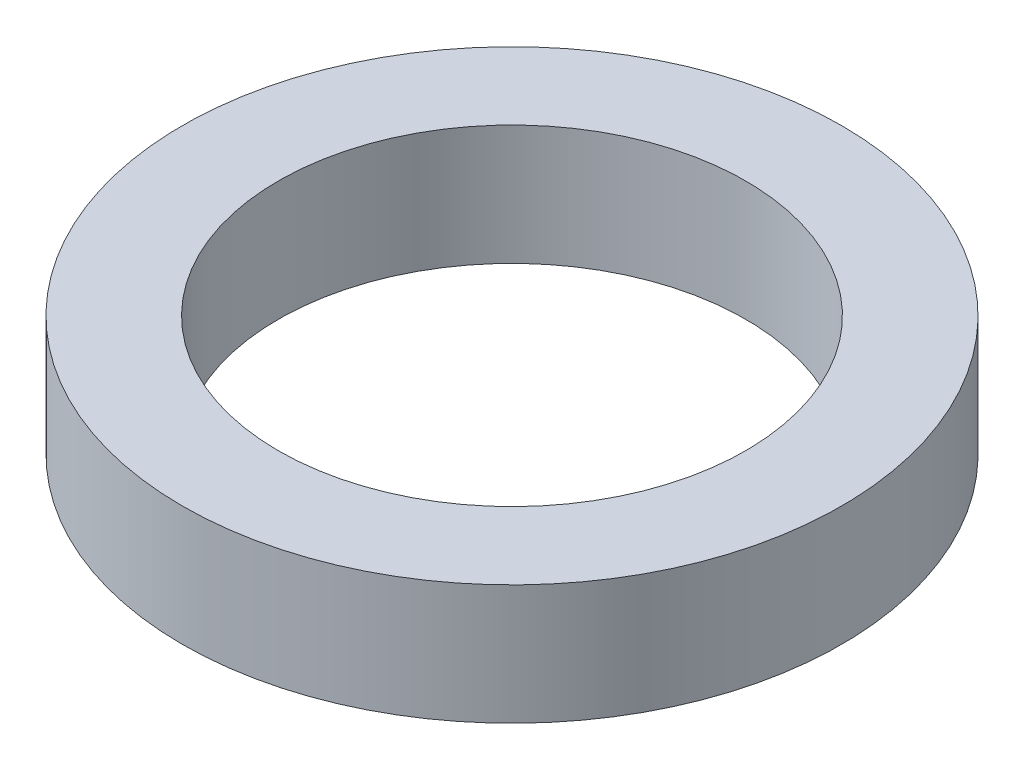
ISO-10303-21;
HEADER;
FILE_DESCRIPTION(('STEP AP214'),'2;1');
FILE_NAME('part.step','',(''),(''),'','','');
FILE_SCHEMA(('AUTOMOTIVE_DESIGN { 1 0 10303 214 1 1 1 1 }'));
ENDSEC;
DATA;
#1=APPLICATION_CONTEXT('core data for automotive mechanical design processes');
#2=APPLICATION_PROTOCOL_DEFINITION('international standard','automotive_design',2000,#1);
#3=PRODUCT_CONTEXT('',#1,'mechanical');
#4=PRODUCT('Part','Part','',(#3));
#5=PRODUCT_RELATED_PRODUCT_CATEGORY('part','',(#4));
#6=PRODUCT_DEFINITION_FORMATION('','',#4);
#7=PRODUCT_DEFINITION_CONTEXT('part definition',#1,'design');
#8=PRODUCT_DEFINITION('design','',#6,#7);
#9=PRODUCT_DEFINITION_SHAPE('','',#8);
#10=(LENGTH_UNIT() NAMED_UNIT(*) SI_UNIT(.MILLI.,.METRE.));
#11=(NAMED_UNIT(*) PLANE_ANGLE_UNIT() SI_UNIT($,.RADIAN.));
#12=(NAMED_UNIT(*) SI_UNIT($,.STERADIAN.) SOLID_ANGLE_UNIT());
#13=UNCERTAINTY_MEASURE_WITH_UNIT(LENGTH_MEASURE(1.E-05),#10,'distance_accuracy_value','');
#14=(GEOMETRIC_REPRESENTATION_CONTEXT(3) GLOBAL_UNCERTAINTY_ASSIGNED_CONTEXT((#13)) GLOBAL_UNIT_ASSIGNED_CONTEXT((#10,
#11,#12)) REPRESENTATION_CONTEXT('',''));
#15=CARTESIAN_POINT('',(0.,0.,0.));
#16=DIRECTION('',(0.,0.,1.));
#17=DIRECTION('',(1.,0.,0.));
#18=AXIS2_PLACEMENT_3D('',#15,#16,#17);
#19=CARTESIAN_POINT('',(0.,1.016,0.));
#20=DIRECTION('',(0.,1.,0.));
#21=DIRECTION('',(0.,0.,1.));
#22=AXIS2_PLACEMENT_3D('',#19,#20,#21);
#23=PLANE('',#22);
#24=CARTESIAN_POINT('',(0.,1.016,0.));
#25=DIRECTION('',(0.,1.,0.));
#26=DIRECTION('',(0.,0.,1.));
#27=AXIS2_PLACEMENT_3D('',#24,#25,#26);
#28=CIRCLE('',#27,2.794);
#29=CARTESIAN_POINT('',(0.,1.016,2.794));
#30=VERTEX_POINT('',#29);
#31=EDGE_CURVE('E10',#30,#30,#28,.T.);
#32=ORIENTED_EDGE('',*,*,#31,.T.);
#33=EDGE_LOOP('',(#32));
#34=FACE_BOUND('',#33,.T.);
#35=CARTESIAN_POINT('',(0.,1.016,0.));
#36=DIRECTION('',(0.,1.,0.));
#37=DIRECTION('',(0.,0.,1.));
#38=AXIS2_PLACEMENT_3D('',#35,#36,#37);
#39=CIRCLE('',#38,1.9812);
#40=CARTESIAN_POINT('',(0.,1.016,1.9812));
#41=VERTEX_POINT('',#40);
#42=EDGE_CURVE('E43',#41,#41,#39,.T.);
#43=ORIENTED_EDGE('',*,*,#42,.F.);
#44=EDGE_LOOP('',(#43));
#45=FACE_BOUND('',#44,.T.);
#46=ADVANCED_FACE('F32',(#34,#45),#23,.T.);
#47=CARTESIAN_POINT('',(0.,0.,0.));
#48=DIRECTION('',(0.,1.,0.));
#49=DIRECTION('',(0.,0.,1.));
#50=AXIS2_PLACEMENT_3D('',#47,#48,#49);
#51=PLANE('',#50);
#52=CARTESIAN_POINT('',(0.,0.,0.));
#53=DIRECTION('',(0.,1.,0.));
#54=DIRECTION('',(0.,0.,1.));
#55=AXIS2_PLACEMENT_3D('',#52,#53,#54);
#56=CIRCLE('',#55,2.794);
#57=CARTESIAN_POINT('',(0.,0.,2.794));
#58=VERTEX_POINT('',#57);
#59=EDGE_CURVE('E36',#58,#58,#56,.T.);
#60=ORIENTED_EDGE('',*,*,#59,.F.);
#61=EDGE_LOOP('',(#60));
#62=FACE_BOUND('',#61,.T.);
#63=CARTESIAN_POINT('',(0.,0.,0.));
#64=DIRECTION('',(0.,1.,0.));
#65=DIRECTION('',(0.,0.,1.));
#66=AXIS2_PLACEMENT_3D('',#63,#64,#65);
#67=CIRCLE('',#66,1.9812);
#68=CARTESIAN_POINT('',(0.,0.,1.9812));
#69=VERTEX_POINT('',#68);
#70=EDGE_CURVE('E45',#69,#69,#67,.T.);
#71=ORIENTED_EDGE('',*,*,#70,.T.);
#72=EDGE_LOOP('',(#71));
#73=FACE_BOUND('',#72,.T.);
#74=ADVANCED_FACE('F55',(#62,#73),#51,.F.);
#75=CARTESIAN_POINT('',(0.,1.016,0.));
#76=DIRECTION('',(0.,-1.,0.));
#77=DIRECTION('',(0.,0.,-1.));
#78=AXIS2_PLACEMENT_3D('',#75,#76,#77);
#79=CYLINDRICAL_SURFACE('',#78,2.794);
#80=ORIENTED_EDGE('',*,*,#31,.F.);
#81=EDGE_LOOP('',(#80));
#82=FACE_BOUND('',#81,.T.);
#83=ORIENTED_EDGE('',*,*,#59,.T.);
#84=EDGE_LOOP('',(#83));
#85=FACE_BOUND('',#84,.T.);
#86=ADVANCED_FACE('F34',(#82,#85),#79,.T.);
#87=CARTESIAN_POINT('',(0.,1.016,0.));
#88=DIRECTION('',(0.,-1.,0.));
#89=DIRECTION('',(0.,0.,-1.));
#90=AXIS2_PLACEMENT_3D('',#87,#88,#89);
#91=CYLINDRICAL_SURFACE('',#90,1.9812);
#92=ORIENTED_EDGE('',*,*,#42,.T.);
#93=EDGE_LOOP('',(#92));
#94=FACE_BOUND('',#93,.T.);
#95=ORIENTED_EDGE('',*,*,#70,.F.);
#96=EDGE_LOOP('',(#95));
#97=FACE_BOUND('',#96,.T.);
#98=ADVANCED_FACE('F51',(#94,#97),#91,.F.);
#99=CLOSED_SHELL('',(#46,#74,#86,#98));
#100=MANIFOLD_SOLID_BREP('B2',#99);
#101=ADVANCED_BREP_SHAPE_REPRESENTATION('',(#18,#100),#14);
#102=SHAPE_DEFINITION_REPRESENTATION(#9,#101);
ENDSEC;
END-ISO-10303-21;
